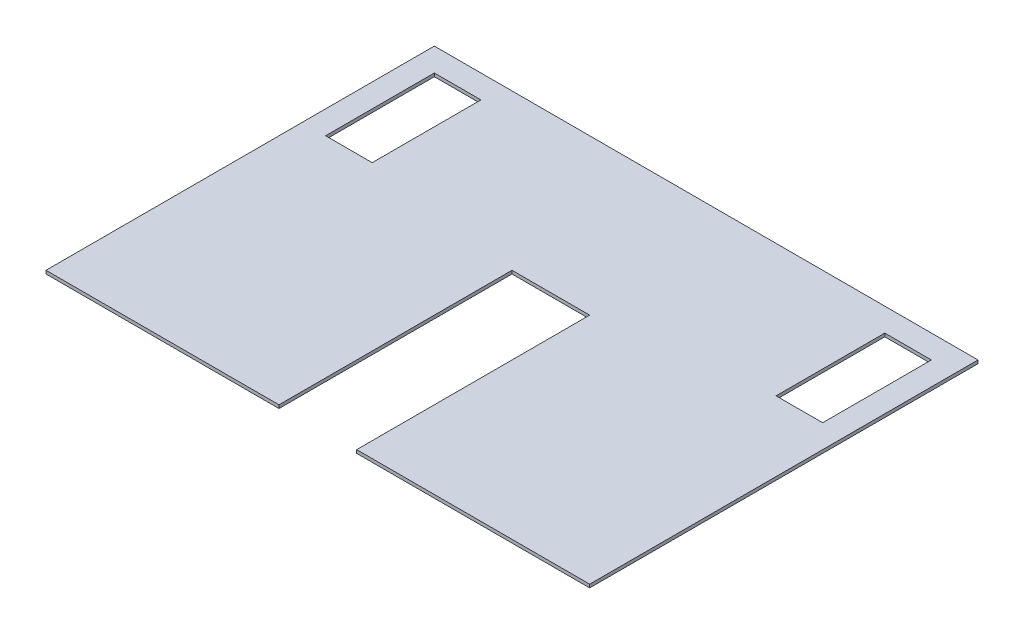
ISO-10303-21;
HEADER;
FILE_DESCRIPTION(('STEP AP214'),'2;1');
FILE_NAME('part.step','',(''),(''),'','','');
FILE_SCHEMA(('AUTOMOTIVE_DESIGN { 1 0 10303 214 1 1 1 1 }'));
ENDSEC;
DATA;
#1=APPLICATION_CONTEXT('core data for automotive mechanical design processes');
#2=APPLICATION_PROTOCOL_DEFINITION('international standard','automotive_design',2000,#1);
#3=PRODUCT_CONTEXT('',#1,'mechanical');
#4=PRODUCT('Part','Part','',(#3));
#5=PRODUCT_RELATED_PRODUCT_CATEGORY('part','',(#4));
#6=PRODUCT_DEFINITION_FORMATION('','',#4);
#7=PRODUCT_DEFINITION_CONTEXT('part definition',#1,'design');
#8=PRODUCT_DEFINITION('design','',#6,#7);
#9=PRODUCT_DEFINITION_SHAPE('','',#8);
#10=(LENGTH_UNIT() NAMED_UNIT(*) SI_UNIT(.MILLI.,.METRE.));
#11=(NAMED_UNIT(*) PLANE_ANGLE_UNIT() SI_UNIT($,.RADIAN.));
#12=(NAMED_UNIT(*) SI_UNIT($,.STERADIAN.) SOLID_ANGLE_UNIT());
#13=UNCERTAINTY_MEASURE_WITH_UNIT(LENGTH_MEASURE(1.E-05),#10,'distance_accuracy_value','');
#14=(GEOMETRIC_REPRESENTATION_CONTEXT(3) GLOBAL_UNCERTAINTY_ASSIGNED_CONTEXT((#13)) GLOBAL_UNIT_ASSIGNED_CONTEXT((#10,
#11,#12)) REPRESENTATION_CONTEXT('',''));
#15=CARTESIAN_POINT('',(0.,0.,0.));
#16=DIRECTION('',(0.,0.,1.));
#17=DIRECTION('',(1.,0.,0.));
#18=AXIS2_PLACEMENT_3D('',#15,#16,#17);
#19=CARTESIAN_POINT('',(0.,1.0668,0.));
#20=DIRECTION('',(0.,0.,-1.));
#21=DIRECTION('',(-1.,0.,0.));
#22=AXIS2_PLACEMENT_3D('',#19,#20,#21);
#23=PLANE('',#22);
#24=DIRECTION('',(1.,0.,0.));
#25=VECTOR('',#24,1.);
#26=CARTESIAN_POINT('',(0.,0.,0.));
#27=LINE('',#26,#25);
#28=CARTESIAN_POINT('',(-177.8,0.,0.));
#29=VERTEX_POINT('',#28);
#30=CARTESIAN_POINT('',(-101.6,0.,0.));
#31=VERTEX_POINT('',#30);
#32=EDGE_CURVE('E246',#29,#31,#27,.T.);
#33=ORIENTED_EDGE('',*,*,#32,.T.);
#34=DIRECTION('',(0.,1.,0.));
#35=VECTOR('',#34,1.);
#36=CARTESIAN_POINT('',(-101.6,0.,0.));
#37=LINE('',#36,#35);
#38=CARTESIAN_POINT('',(-101.6,1.0668,0.));
#39=VERTEX_POINT('',#38);
#40=EDGE_CURVE('E233',#31,#39,#37,.T.);
#41=ORIENTED_EDGE('',*,*,#40,.T.);
#42=DIRECTION('',(1.,0.,0.));
#43=VECTOR('',#42,1.);
#44=CARTESIAN_POINT('',(0.,1.0668,0.));
#45=LINE('',#44,#43);
#46=CARTESIAN_POINT('',(-177.8,1.0668,0.));
#47=VERTEX_POINT('',#46);
#48=EDGE_CURVE('E251',#47,#39,#45,.T.);
#49=ORIENTED_EDGE('',*,*,#48,.F.);
#50=DIRECTION('',(0.,-1.,0.));
#51=VECTOR('',#50,1.);
#52=CARTESIAN_POINT('',(-177.8,1.0668,0.));
#53=LINE('',#52,#51);
#54=EDGE_CURVE('E266',#47,#29,#53,.T.);
#55=ORIENTED_EDGE('',*,*,#54,.T.);
#56=EDGE_LOOP('',(#33,#41,#49,#55));
#57=FACE_BOUND('',#56,.T.);
#58=ADVANCED_FACE('F34',(#57),#23,.F.);
#59=CARTESIAN_POINT('',(0.,1.0668,0.));
#60=DIRECTION('',(-1.,0.,0.));
#61=DIRECTION('',(0.,0.,1.));
#62=AXIS2_PLACEMENT_3D('',#59,#60,#61);
#63=PLANE('',#62);
#64=DIRECTION('',(0.,0.,-1.));
#65=VECTOR('',#64,1.);
#66=CARTESIAN_POINT('',(0.,0.,0.));
#67=LINE('',#66,#65);
#68=CARTESIAN_POINT('',(0.,0.,0.));
#69=VERTEX_POINT('',#68);
#70=CARTESIAN_POINT('',(0.,0.,-127.));
#71=VERTEX_POINT('',#70);
#72=EDGE_CURVE('E236',#69,#71,#67,.T.);
#73=ORIENTED_EDGE('',*,*,#72,.T.);
#74=DIRECTION('',(0.,-1.,0.));
#75=VECTOR('',#74,1.);
#76=CARTESIAN_POINT('',(0.,1.0668,-127.));
#77=LINE('',#76,#75);
#78=CARTESIAN_POINT('',(0.,1.0668,-127.));
#79=VERTEX_POINT('',#78);
#80=EDGE_CURVE('E11',#79,#71,#77,.T.);
#81=ORIENTED_EDGE('',*,*,#80,.F.);
#82=DIRECTION('',(0.,0.,-1.));
#83=VECTOR('',#82,1.);
#84=CARTESIAN_POINT('',(0.,1.0668,0.));
#85=LINE('',#84,#83);
#86=CARTESIAN_POINT('',(0.,1.0668,0.));
#87=VERTEX_POINT('',#86);
#88=EDGE_CURVE('E242',#87,#79,#85,.T.);
#89=ORIENTED_EDGE('',*,*,#88,.F.);
#90=DIRECTION('',(0.,-1.,0.));
#91=VECTOR('',#90,1.);
#92=CARTESIAN_POINT('',(0.,1.0668,0.));
#93=LINE('',#92,#91);
#94=EDGE_CURVE('E254',#87,#69,#93,.T.);
#95=ORIENTED_EDGE('',*,*,#94,.T.);
#96=EDGE_LOOP('',(#73,#81,#89,#95));
#97=FACE_BOUND('',#96,.T.);
#98=ADVANCED_FACE('F36',(#97),#63,.F.);
#99=CARTESIAN_POINT('',(0.,1.0668,-127.));
#100=DIRECTION('',(0.,0.,1.));
#101=DIRECTION('',(1.,0.,0.));
#102=AXIS2_PLACEMENT_3D('',#99,#100,#101);
#103=PLANE('',#102);
#104=DIRECTION('',(-1.,0.,0.));
#105=VECTOR('',#104,1.);
#106=CARTESIAN_POINT('',(0.,0.,-127.));
#107=LINE('',#106,#105);
#108=CARTESIAN_POINT('',(-177.8,0.,-127.));
#109=VERTEX_POINT('',#108);
#110=EDGE_CURVE('E257',#71,#109,#107,.T.);
#111=ORIENTED_EDGE('',*,*,#110,.T.);
#112=DIRECTION('',(0.,-1.,0.));
#113=VECTOR('',#112,1.);
#114=CARTESIAN_POINT('',(-177.8,1.0668,-127.));
#115=LINE('',#114,#113);
#116=CARTESIAN_POINT('',(-177.8,1.0668,-127.));
#117=VERTEX_POINT('',#116);
#118=EDGE_CURVE('E42',#117,#109,#115,.T.);
#119=ORIENTED_EDGE('',*,*,#118,.F.);
#120=DIRECTION('',(-1.,0.,0.));
#121=VECTOR('',#120,1.);
#122=CARTESIAN_POINT('',(0.,1.0668,-127.));
#123=LINE('',#122,#121);
#124=EDGE_CURVE('E245',#79,#117,#123,.T.);
#125=ORIENTED_EDGE('',*,*,#124,.F.);
#126=ORIENTED_EDGE('',*,*,#80,.T.);
#127=EDGE_LOOP('',(#111,#119,#125,#126));
#128=FACE_BOUND('',#127,.T.);
#129=ADVANCED_FACE('F288',(#128),#103,.F.);
#130=CARTESIAN_POINT('',(-177.8,1.0668,0.));
#131=DIRECTION('',(1.,0.,0.));
#132=DIRECTION('',(0.,0.,-1.));
#133=AXIS2_PLACEMENT_3D('',#130,#131,#132);
#134=PLANE('',#133);
#135=DIRECTION('',(0.,0.,1.));
#136=VECTOR('',#135,1.);
#137=CARTESIAN_POINT('',(-177.8,0.,0.));
#138=LINE('',#137,#136);
#139=EDGE_CURVE('E259',#109,#29,#138,.T.);
#140=ORIENTED_EDGE('',*,*,#139,.T.);
#141=ORIENTED_EDGE('',*,*,#54,.F.);
#142=DIRECTION('',(0.,0.,1.));
#143=VECTOR('',#142,1.);
#144=CARTESIAN_POINT('',(-177.8,1.0668,0.));
#145=LINE('',#144,#143);
#146=EDGE_CURVE('E248',#117,#47,#145,.T.);
#147=ORIENTED_EDGE('',*,*,#146,.F.);
#148=ORIENTED_EDGE('',*,*,#118,.T.);
#149=EDGE_LOOP('',(#140,#141,#147,#148));
#150=FACE_BOUND('',#149,.T.);
#151=ADVANCED_FACE('F273',(#150),#134,.F.);
#152=CARTESIAN_POINT('',(-76.1999999999999,1.0668,0.));
#153=VERTEX_POINT('',#152);
#154=EDGE_CURVE('E250',#153,#87,#45,.T.);
#155=ORIENTED_EDGE('',*,*,#154,.F.);
#156=DIRECTION('',(0.,1.,0.));
#157=VECTOR('',#156,1.);
#158=CARTESIAN_POINT('',(-76.1999999999999,0.,0.));
#159=LINE('',#158,#157);
#160=CARTESIAN_POINT('',(-76.1999999999999,0.,0.));
#161=VERTEX_POINT('',#160);
#162=EDGE_CURVE('E226',#161,#153,#159,.T.);
#163=ORIENTED_EDGE('',*,*,#162,.F.);
#164=EDGE_CURVE('E261',#161,#69,#27,.T.);
#165=ORIENTED_EDGE('',*,*,#164,.T.);
#166=ORIENTED_EDGE('',*,*,#94,.F.);
#167=EDGE_LOOP('',(#155,#163,#165,#166));
#168=FACE_BOUND('',#167,.T.);
#169=ADVANCED_FACE('F295',(#168),#23,.F.);
#170=CARTESIAN_POINT('',(0.,1.0668,0.));
#171=DIRECTION('',(0.,1.,0.));
#172=DIRECTION('',(0.,0.,1.));
#173=AXIS2_PLACEMENT_3D('',#170,#171,#172);
#174=PLANE('',#173);
#175=DIRECTION('',(-1.,0.,0.));
#176=VECTOR('',#175,1.);
#177=CARTESIAN_POINT('',(-7.62000000000001,1.0668,-119.38));
#178=LINE('',#177,#176);
#179=CARTESIAN_POINT('',(-7.62000000000001,1.0668,-119.38));
#180=VERTEX_POINT('',#179);
#181=CARTESIAN_POINT('',(-22.8599999999999,1.0668,-119.38));
#182=VERTEX_POINT('',#181);
#183=EDGE_CURVE('E49',#180,#182,#178,.T.);
#184=ORIENTED_EDGE('',*,*,#183,.F.);
#185=DIRECTION('',(0.,0.,-1.));
#186=VECTOR('',#185,1.);
#187=CARTESIAN_POINT('',(-7.62000000000001,1.0668,-119.38));
#188=LINE('',#187,#186);
#189=CARTESIAN_POINT('',(-7.62000000000001,1.0668,-83.8199999999995));
#190=VERTEX_POINT('',#189);
#191=EDGE_CURVE('E165',#190,#180,#188,.T.);
#192=ORIENTED_EDGE('',*,*,#191,.F.);
#193=DIRECTION('',(1.,0.,0.));
#194=VECTOR('',#193,1.);
#195=CARTESIAN_POINT('',(-22.8599999999999,1.0668,-83.8199999999995));
#196=LINE('',#195,#194);
#197=CARTESIAN_POINT('',(-22.8599999999999,1.0668,-83.8199999999995));
#198=VERTEX_POINT('',#197);
#199=EDGE_CURVE('E168',#198,#190,#196,.T.);
#200=ORIENTED_EDGE('',*,*,#199,.F.);
#201=DIRECTION('',(0.,0.,1.));
#202=VECTOR('',#201,1.);
#203=CARTESIAN_POINT('',(-22.8599999999999,1.0668,-119.38));
#204=LINE('',#203,#202);
#205=EDGE_CURVE('E174',#182,#198,#204,.T.);
#206=ORIENTED_EDGE('',*,*,#205,.F.);
#207=EDGE_LOOP('',(#184,#192,#200,#206));
#208=FACE_BOUND('',#207,.T.);
#209=DIRECTION('',(0.,0.,1.));
#210=VECTOR('',#209,1.);
#211=CARTESIAN_POINT('',(-170.18,1.0668,-119.38));
#212=LINE('',#211,#210);
#213=CARTESIAN_POINT('',(-170.18,1.0668,-119.38));
#214=VERTEX_POINT('',#213);
#215=CARTESIAN_POINT('',(-170.18,1.0668,-83.8200000000001));
#216=VERTEX_POINT('',#215);
#217=EDGE_CURVE('E180',#214,#216,#212,.T.);
#218=ORIENTED_EDGE('',*,*,#217,.F.);
#219=DIRECTION('',(-1.,0.,0.));
#220=VECTOR('',#219,1.);
#221=CARTESIAN_POINT('',(-154.94,1.0668,-119.38));
#222=LINE('',#221,#220);
#223=CARTESIAN_POINT('',(-154.94,1.0668,-119.38));
#224=VERTEX_POINT('',#223);
#225=EDGE_CURVE('E188',#224,#214,#222,.T.);
#226=ORIENTED_EDGE('',*,*,#225,.F.);
#227=DIRECTION('',(0.,0.,-1.));
#228=VECTOR('',#227,1.);
#229=CARTESIAN_POINT('',(-154.94,1.0668,-83.8200000000001));
#230=LINE('',#229,#228);
#231=CARTESIAN_POINT('',(-154.94,1.0668,-83.8200000000001));
#232=VERTEX_POINT('',#231);
#233=EDGE_CURVE('E202',#232,#224,#230,.T.);
#234=ORIENTED_EDGE('',*,*,#233,.F.);
#235=DIRECTION('',(1.,0.,0.));
#236=VECTOR('',#235,1.);
#237=CARTESIAN_POINT('',(-170.18,1.0668,-83.8200000000001));
#238=LINE('',#237,#236);
#239=EDGE_CURVE('E199',#216,#232,#238,.T.);
#240=ORIENTED_EDGE('',*,*,#239,.F.);
#241=EDGE_LOOP('',(#218,#226,#234,#240));
#242=FACE_BOUND('',#241,.T.);
#243=DIRECTION('',(0.,0.,1.));
#244=VECTOR('',#243,1.);
#245=CARTESIAN_POINT('',(-101.6,1.0668,-76.1999999999995));
#246=LINE('',#245,#244);
#247=CARTESIAN_POINT('',(-101.6,1.0668,-76.1999999999995));
#248=VERTEX_POINT('',#247);
#249=EDGE_CURVE('E220',#248,#39,#246,.T.);
#250=ORIENTED_EDGE('',*,*,#249,.F.);
#251=DIRECTION('',(-1.,0.,0.));
#252=VECTOR('',#251,1.);
#253=CARTESIAN_POINT('',(-101.6,1.0668,-76.1999999999995));
#254=LINE('',#253,#252);
#255=CARTESIAN_POINT('',(-76.1999999999998,1.0668,-76.1999999999995));
#256=VERTEX_POINT('',#255);
#257=EDGE_CURVE('E229',#256,#248,#254,.T.);
#258=ORIENTED_EDGE('',*,*,#257,.F.);
#259=DIRECTION('',(0.,0.,-1.));
#260=VECTOR('',#259,1.);
#261=CARTESIAN_POINT('',(-76.1999999999998,1.0668,-76.1999999999995));
#262=LINE('',#261,#260);
#263=EDGE_CURVE('E209',#153,#256,#262,.T.);
#264=ORIENTED_EDGE('',*,*,#263,.F.);
#265=ORIENTED_EDGE('',*,*,#154,.T.);
#266=ORIENTED_EDGE('',*,*,#88,.T.);
#267=ORIENTED_EDGE('',*,*,#124,.T.);
#268=ORIENTED_EDGE('',*,*,#146,.T.);
#269=ORIENTED_EDGE('',*,*,#48,.T.);
#270=EDGE_LOOP('',(#250,#258,#264,#265,#266,#267,#268,#269));
#271=FACE_BOUND('',#270,.T.);
#272=ADVANCED_FACE('F284',(#208,#242,#271),#174,.T.);
#273=CARTESIAN_POINT('',(0.,0.,0.));
#274=DIRECTION('',(0.,1.,0.));
#275=DIRECTION('',(0.,0.,1.));
#276=AXIS2_PLACEMENT_3D('',#273,#274,#275);
#277=PLANE('',#276);
#278=DIRECTION('',(0.,0.,-1.));
#279=VECTOR('',#278,1.);
#280=CARTESIAN_POINT('',(-7.62000000000001,0.,-119.38));
#281=LINE('',#280,#279);
#282=CARTESIAN_POINT('',(-7.62000000000001,0.,-83.8199999999995));
#283=VERTEX_POINT('',#282);
#284=CARTESIAN_POINT('',(-7.62000000000001,0.,-119.38));
#285=VERTEX_POINT('',#284);
#286=EDGE_CURVE('E155',#283,#285,#281,.T.);
#287=ORIENTED_EDGE('',*,*,#286,.T.);
#288=DIRECTION('',(-1.,0.,0.));
#289=VECTOR('',#288,1.);
#290=CARTESIAN_POINT('',(-7.62000000000001,0.,-119.38));
#291=LINE('',#290,#289);
#292=CARTESIAN_POINT('',(-22.8599999999999,0.,-119.38));
#293=VERTEX_POINT('',#292);
#294=EDGE_CURVE('E149',#285,#293,#291,.T.);
#295=ORIENTED_EDGE('',*,*,#294,.T.);
#296=DIRECTION('',(0.,0.,1.));
#297=VECTOR('',#296,1.);
#298=CARTESIAN_POINT('',(-22.8599999999999,0.,-119.38));
#299=LINE('',#298,#297);
#300=CARTESIAN_POINT('',(-22.8599999999999,0.,-83.8199999999995));
#301=VERTEX_POINT('',#300);
#302=EDGE_CURVE('E158',#293,#301,#299,.T.);
#303=ORIENTED_EDGE('',*,*,#302,.T.);
#304=DIRECTION('',(1.,0.,0.));
#305=VECTOR('',#304,1.);
#306=CARTESIAN_POINT('',(-22.8599999999999,0.,-83.8199999999995));
#307=LINE('',#306,#305);
#308=EDGE_CURVE('E57',#301,#283,#307,.T.);
#309=ORIENTED_EDGE('',*,*,#308,.T.);
#310=EDGE_LOOP('',(#287,#295,#303,#309));
#311=FACE_BOUND('',#310,.T.);
#312=DIRECTION('',(-1.,0.,0.));
#313=VECTOR('',#312,1.);
#314=CARTESIAN_POINT('',(-154.94,0.,-119.38));
#315=LINE('',#314,#313);
#316=CARTESIAN_POINT('',(-154.94,0.,-119.38));
#317=VERTEX_POINT('',#316);
#318=CARTESIAN_POINT('',(-170.18,0.,-119.38));
#319=VERTEX_POINT('',#318);
#320=EDGE_CURVE('E194',#317,#319,#315,.T.);
#321=ORIENTED_EDGE('',*,*,#320,.T.);
#322=DIRECTION('',(0.,0.,1.));
#323=VECTOR('',#322,1.);
#324=CARTESIAN_POINT('',(-170.18,0.,-119.38));
#325=LINE('',#324,#323);
#326=CARTESIAN_POINT('',(-170.18,0.,-83.8200000000001));
#327=VERTEX_POINT('',#326);
#328=EDGE_CURVE('E184',#319,#327,#325,.T.);
#329=ORIENTED_EDGE('',*,*,#328,.T.);
#330=DIRECTION('',(1.,0.,0.));
#331=VECTOR('',#330,1.);
#332=CARTESIAN_POINT('',(-170.18,0.,-83.8200000000001));
#333=LINE('',#332,#331);
#334=CARTESIAN_POINT('',(-154.94,0.,-83.8200000000001));
#335=VERTEX_POINT('',#334);
#336=EDGE_CURVE('E187',#327,#335,#333,.T.);
#337=ORIENTED_EDGE('',*,*,#336,.T.);
#338=DIRECTION('',(0.,0.,-1.));
#339=VECTOR('',#338,1.);
#340=CARTESIAN_POINT('',(-154.94,0.,-83.8200000000001));
#341=LINE('',#340,#339);
#342=EDGE_CURVE('E191',#335,#317,#341,.T.);
#343=ORIENTED_EDGE('',*,*,#342,.T.);
#344=EDGE_LOOP('',(#321,#329,#337,#343));
#345=FACE_BOUND('',#344,.T.);
#346=DIRECTION('',(-1.,0.,0.));
#347=VECTOR('',#346,1.);
#348=CARTESIAN_POINT('',(-101.6,0.,-76.1999999999995));
#349=LINE('',#348,#347);
#350=CARTESIAN_POINT('',(-76.1999999999998,0.,-76.1999999999995));
#351=VERTEX_POINT('',#350);
#352=CARTESIAN_POINT('',(-101.6,0.,-76.1999999999995));
#353=VERTEX_POINT('',#352);
#354=EDGE_CURVE('E219',#351,#353,#349,.T.);
#355=ORIENTED_EDGE('',*,*,#354,.T.);
#356=DIRECTION('',(0.,0.,1.));
#357=VECTOR('',#356,1.);
#358=CARTESIAN_POINT('',(-101.6,0.,-76.1999999999995));
#359=LINE('',#358,#357);
#360=EDGE_CURVE('E223',#353,#31,#359,.T.);
#361=ORIENTED_EDGE('',*,*,#360,.T.);
#362=ORIENTED_EDGE('',*,*,#32,.F.);
#363=ORIENTED_EDGE('',*,*,#139,.F.);
#364=ORIENTED_EDGE('',*,*,#110,.F.);
#365=ORIENTED_EDGE('',*,*,#72,.F.);
#366=ORIENTED_EDGE('',*,*,#164,.F.);
#367=DIRECTION('',(0.,0.,-1.));
#368=VECTOR('',#367,1.);
#369=CARTESIAN_POINT('',(-76.1999999999998,0.,-76.1999999999995));
#370=LINE('',#369,#368);
#371=EDGE_CURVE('E216',#161,#351,#370,.T.);
#372=ORIENTED_EDGE('',*,*,#371,.T.);
#373=EDGE_LOOP('',(#355,#361,#362,#363,#364,#365,#366,#372));
#374=FACE_BOUND('',#373,.T.);
#375=ADVANCED_FACE('F162',(#311,#345,#374),#277,.F.);
#376=CARTESIAN_POINT('',(-101.6,0.,-76.1999999999995));
#377=DIRECTION('',(-1.,0.,0.));
#378=DIRECTION('',(0.,0.,1.));
#379=AXIS2_PLACEMENT_3D('',#376,#377,#378);
#380=PLANE('',#379);
#381=ORIENTED_EDGE('',*,*,#249,.T.);
#382=ORIENTED_EDGE('',*,*,#40,.F.);
#383=ORIENTED_EDGE('',*,*,#360,.F.);
#384=DIRECTION('',(0.,1.,0.));
#385=VECTOR('',#384,1.);
#386=CARTESIAN_POINT('',(-101.6,0.,-76.1999999999995));
#387=LINE('',#386,#385);
#388=EDGE_CURVE('E237',#353,#248,#387,.T.);
#389=ORIENTED_EDGE('',*,*,#388,.T.);
#390=EDGE_LOOP('',(#381,#382,#383,#389));
#391=FACE_BOUND('',#390,.T.);
#392=ADVANCED_FACE('F303',(#391),#380,.F.);
#393=CARTESIAN_POINT('',(-101.6,0.,-76.1999999999995));
#394=DIRECTION('',(0.,0.,-1.));
#395=DIRECTION('',(-1.,0.,0.));
#396=AXIS2_PLACEMENT_3D('',#393,#394,#395);
#397=PLANE('',#396);
#398=ORIENTED_EDGE('',*,*,#257,.T.);
#399=ORIENTED_EDGE('',*,*,#388,.F.);
#400=ORIENTED_EDGE('',*,*,#354,.F.);
#401=DIRECTION('',(0.,1.,0.));
#402=VECTOR('',#401,1.);
#403=CARTESIAN_POINT('',(-76.1999999999998,0.,-76.1999999999995));
#404=LINE('',#403,#402);
#405=EDGE_CURVE('E239',#351,#256,#404,.T.);
#406=ORIENTED_EDGE('',*,*,#405,.T.);
#407=EDGE_LOOP('',(#398,#399,#400,#406));
#408=FACE_BOUND('',#407,.T.);
#409=ADVANCED_FACE('F301',(#408),#397,.F.);
#410=CARTESIAN_POINT('',(-76.1999999999998,0.,-76.1999999999995));
#411=DIRECTION('',(1.,0.,0.));
#412=DIRECTION('',(0.,0.,-1.));
#413=AXIS2_PLACEMENT_3D('',#410,#411,#412);
#414=PLANE('',#413);
#415=ORIENTED_EDGE('',*,*,#263,.T.);
#416=ORIENTED_EDGE('',*,*,#405,.F.);
#417=ORIENTED_EDGE('',*,*,#371,.F.);
#418=ORIENTED_EDGE('',*,*,#162,.T.);
#419=EDGE_LOOP('',(#415,#416,#417,#418));
#420=FACE_BOUND('',#419,.T.);
#421=ADVANCED_FACE('F298',(#420),#414,.F.);
#422=CARTESIAN_POINT('',(-170.18,0.,-119.38));
#423=DIRECTION('',(-1.,0.,0.));
#424=DIRECTION('',(0.,0.,1.));
#425=AXIS2_PLACEMENT_3D('',#422,#423,#424);
#426=PLANE('',#425);
#427=ORIENTED_EDGE('',*,*,#217,.T.);
#428=DIRECTION('',(0.,1.,0.));
#429=VECTOR('',#428,1.);
#430=CARTESIAN_POINT('',(-170.18,0.,-83.8200000000001));
#431=LINE('',#430,#429);
#432=EDGE_CURVE('E197',#327,#216,#431,.T.);
#433=ORIENTED_EDGE('',*,*,#432,.F.);
#434=ORIENTED_EDGE('',*,*,#328,.F.);
#435=DIRECTION('',(0.,1.,0.));
#436=VECTOR('',#435,1.);
#437=CARTESIAN_POINT('',(-170.18,0.,-119.38));
#438=LINE('',#437,#436);
#439=EDGE_CURVE('E207',#319,#214,#438,.T.);
#440=ORIENTED_EDGE('',*,*,#439,.T.);
#441=EDGE_LOOP('',(#427,#433,#434,#440));
#442=FACE_BOUND('',#441,.T.);
#443=ADVANCED_FACE('F378',(#442),#426,.F.);
#444=CARTESIAN_POINT('',(-154.94,0.,-119.38));
#445=DIRECTION('',(0.,0.,-1.));
#446=DIRECTION('',(-1.,0.,0.));
#447=AXIS2_PLACEMENT_3D('',#444,#445,#446);
#448=PLANE('',#447);
#449=ORIENTED_EDGE('',*,*,#225,.T.);
#450=ORIENTED_EDGE('',*,*,#439,.F.);
#451=ORIENTED_EDGE('',*,*,#320,.F.);
#452=DIRECTION('',(0.,1.,0.));
#453=VECTOR('',#452,1.);
#454=CARTESIAN_POINT('',(-154.94,0.,-119.38));
#455=LINE('',#454,#453);
#456=EDGE_CURVE('E210',#317,#224,#455,.T.);
#457=ORIENTED_EDGE('',*,*,#456,.T.);
#458=EDGE_LOOP('',(#449,#450,#451,#457));
#459=FACE_BOUND('',#458,.T.);
#460=ADVANCED_FACE('F386',(#459),#448,.F.);
#461=CARTESIAN_POINT('',(-154.94,0.,-83.8200000000001));
#462=DIRECTION('',(1.,0.,0.));
#463=DIRECTION('',(0.,0.,-1.));
#464=AXIS2_PLACEMENT_3D('',#461,#462,#463);
#465=PLANE('',#464);
#466=ORIENTED_EDGE('',*,*,#233,.T.);
#467=ORIENTED_EDGE('',*,*,#456,.F.);
#468=ORIENTED_EDGE('',*,*,#342,.F.);
#469=DIRECTION('',(0.,1.,0.));
#470=VECTOR('',#469,1.);
#471=CARTESIAN_POINT('',(-154.94,0.,-83.8200000000001));
#472=LINE('',#471,#470);
#473=EDGE_CURVE('E212',#335,#232,#472,.T.);
#474=ORIENTED_EDGE('',*,*,#473,.T.);
#475=EDGE_LOOP('',(#466,#467,#468,#474));
#476=FACE_BOUND('',#475,.T.);
#477=ADVANCED_FACE('F394',(#476),#465,.F.);
#478=CARTESIAN_POINT('',(-170.18,0.,-83.8200000000001));
#479=DIRECTION('',(0.,0.,1.));
#480=DIRECTION('',(1.,0.,0.));
#481=AXIS2_PLACEMENT_3D('',#478,#479,#480);
#482=PLANE('',#481);
#483=ORIENTED_EDGE('',*,*,#239,.T.);
#484=ORIENTED_EDGE('',*,*,#473,.F.);
#485=ORIENTED_EDGE('',*,*,#336,.F.);
#486=ORIENTED_EDGE('',*,*,#432,.T.);
#487=EDGE_LOOP('',(#483,#484,#485,#486));
#488=FACE_BOUND('',#487,.T.);
#489=ADVANCED_FACE('F403',(#488),#482,.F.);
#490=CARTESIAN_POINT('',(-7.62000000000001,0.,-119.38));
#491=DIRECTION('',(0.,0.,-1.));
#492=DIRECTION('',(-1.,0.,0.));
#493=AXIS2_PLACEMENT_3D('',#490,#491,#492);
#494=PLANE('',#493);
#495=ORIENTED_EDGE('',*,*,#183,.T.);
#496=DIRECTION('',(0.,1.,0.));
#497=VECTOR('',#496,1.);
#498=CARTESIAN_POINT('',(-22.8599999999999,0.,-119.38));
#499=LINE('',#498,#497);
#500=EDGE_CURVE('E145',#293,#182,#499,.T.);
#501=ORIENTED_EDGE('',*,*,#500,.F.);
#502=ORIENTED_EDGE('',*,*,#294,.F.);
#503=DIRECTION('',(0.,1.,0.));
#504=VECTOR('',#503,1.);
#505=CARTESIAN_POINT('',(-7.62000000000001,0.,-119.38));
#506=LINE('',#505,#504);
#507=EDGE_CURVE('E178',#285,#180,#506,.T.);
#508=ORIENTED_EDGE('',*,*,#507,.T.);
#509=EDGE_LOOP('',(#495,#501,#502,#508));
#510=FACE_BOUND('',#509,.T.);
#511=ADVANCED_FACE('F147',(#510),#494,.F.);
#512=CARTESIAN_POINT('',(-7.62000000000001,0.,-119.38));
#513=DIRECTION('',(1.,0.,0.));
#514=DIRECTION('',(0.,0.,-1.));
#515=AXIS2_PLACEMENT_3D('',#512,#513,#514);
#516=PLANE('',#515);
#517=ORIENTED_EDGE('',*,*,#191,.T.);
#518=ORIENTED_EDGE('',*,*,#507,.F.);
#519=ORIENTED_EDGE('',*,*,#286,.F.);
#520=DIRECTION('',(0.,1.,0.));
#521=VECTOR('',#520,1.);
#522=CARTESIAN_POINT('',(-7.62000000000001,0.,-83.8199999999995));
#523=LINE('',#522,#521);
#524=EDGE_CURVE('E181',#283,#190,#523,.T.);
#525=ORIENTED_EDGE('',*,*,#524,.T.);
#526=EDGE_LOOP('',(#517,#518,#519,#525));
#527=FACE_BOUND('',#526,.T.);
#528=ADVANCED_FACE('F420',(#527),#516,.F.);
#529=CARTESIAN_POINT('',(-22.8599999999999,0.,-83.8199999999995));
#530=DIRECTION('',(0.,0.,1.));
#531=DIRECTION('',(1.,0.,0.));
#532=AXIS2_PLACEMENT_3D('',#529,#530,#531);
#533=PLANE('',#532);
#534=ORIENTED_EDGE('',*,*,#199,.T.);
#535=ORIENTED_EDGE('',*,*,#524,.F.);
#536=ORIENTED_EDGE('',*,*,#308,.F.);
#537=DIRECTION('',(0.,1.,0.));
#538=VECTOR('',#537,1.);
#539=CARTESIAN_POINT('',(-22.8599999999999,0.,-83.8199999999995));
#540=LINE('',#539,#538);
#541=EDGE_CURVE('E154',#301,#198,#540,.T.);
#542=ORIENTED_EDGE('',*,*,#541,.T.);
#543=EDGE_LOOP('',(#534,#535,#536,#542));
#544=FACE_BOUND('',#543,.T.);
#545=ADVANCED_FACE('F428',(#544),#533,.F.);
#546=CARTESIAN_POINT('',(-22.8599999999999,0.,-119.38));
#547=DIRECTION('',(-1.,0.,0.));
#548=DIRECTION('',(0.,0.,1.));
#549=AXIS2_PLACEMENT_3D('',#546,#547,#548);
#550=PLANE('',#549);
#551=ORIENTED_EDGE('',*,*,#205,.T.);
#552=ORIENTED_EDGE('',*,*,#541,.F.);
#553=ORIENTED_EDGE('',*,*,#302,.F.);
#554=ORIENTED_EDGE('',*,*,#500,.T.);
#555=EDGE_LOOP('',(#551,#552,#553,#554));
#556=FACE_BOUND('',#555,.T.);
#557=ADVANCED_FACE('F159',(#556),#550,.F.);
#558=CLOSED_SHELL('',(#58,#98,#129,#151,#169,#272,#375,#392,#409,#421,#443,#460,#477,#489,#511,
#528,#545,#557));
#559=MANIFOLD_SOLID_BREP('B2',#558);
#560=ADVANCED_BREP_SHAPE_REPRESENTATION('',(#18,#559),#14);
#561=SHAPE_DEFINITION_REPRESENTATION(#9,#560);
ENDSEC;
END-ISO-10303-21;
